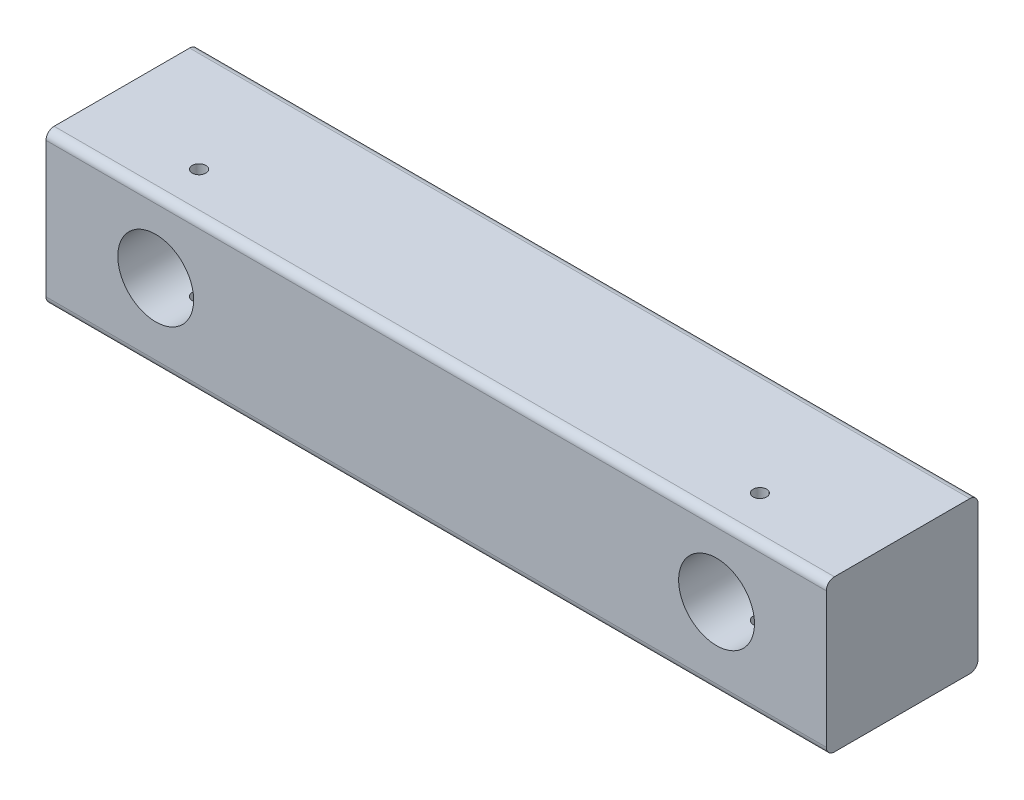
ISO-10303-21;
HEADER;
FILE_DESCRIPTION(('STEP AP214'),'2;1');
FILE_NAME('part.step','',(''),(''),'','','');
FILE_SCHEMA(('AUTOMOTIVE_DESIGN { 1 0 10303 214 1 1 1 1 }'));
ENDSEC;
DATA;
#1=APPLICATION_CONTEXT('core data for automotive mechanical design processes');
#2=APPLICATION_PROTOCOL_DEFINITION('international standard','automotive_design',2000,#1);
#3=PRODUCT_CONTEXT('',#1,'mechanical');
#4=PRODUCT('Part','Part','',(#3));
#5=PRODUCT_RELATED_PRODUCT_CATEGORY('part','',(#4));
#6=PRODUCT_DEFINITION_FORMATION('','',#4);
#7=PRODUCT_DEFINITION_CONTEXT('part definition',#1,'design');
#8=PRODUCT_DEFINITION('design','',#6,#7);
#9=PRODUCT_DEFINITION_SHAPE('','',#8);
#10=(LENGTH_UNIT() NAMED_UNIT(*) SI_UNIT(.MILLI.,.METRE.));
#11=(NAMED_UNIT(*) PLANE_ANGLE_UNIT() SI_UNIT($,.RADIAN.));
#12=(NAMED_UNIT(*) SI_UNIT($,.STERADIAN.) SOLID_ANGLE_UNIT());
#13=UNCERTAINTY_MEASURE_WITH_UNIT(LENGTH_MEASURE(1.E-05),#10,'distance_accuracy_value','');
#14=(GEOMETRIC_REPRESENTATION_CONTEXT(3) GLOBAL_UNCERTAINTY_ASSIGNED_CONTEXT((#13)) GLOBAL_UNIT_ASSIGNED_CONTEXT((#10,
#11,#12)) REPRESENTATION_CONTEXT('',''));
#15=CARTESIAN_POINT('',(0.,0.,0.));
#16=DIRECTION('',(0.,0.,1.));
#17=DIRECTION('',(1.,0.,0.));
#18=AXIS2_PLACEMENT_3D('',#15,#16,#17);
#19=CARTESIAN_POINT('',(0.,0.,-88.9));
#20=DIRECTION('',(0.,0.,-1.));
#21=DIRECTION('',(0.,1.,0.));
#22=AXIS2_PLACEMENT_3D('',#19,#20,#21);
#23=PLANE('',#22);
#24=CARTESIAN_POINT('',(164.309496882,-525.607187924995,-88.9));
#25=DIRECTION('',(0.,0.,1.));
#26=DIRECTION('',(1.,0.,0.));
#27=AXIS2_PLACEMENT_3D('',#24,#25,#26);
#28=CIRCLE('',#27,22.225);
#29=CARTESIAN_POINT('',(186.534496882,-525.607187924995,-88.9));
#30=VERTEX_POINT('',#29);
#31=EDGE_CURVE('E137',#30,#30,#28,.T.);
#32=ORIENTED_EDGE('',*,*,#31,.T.);
#33=EDGE_LOOP('',(#32));
#34=FACE_BOUND('',#33,.T.);
#35=CARTESIAN_POINT('',(-164.309496882,-525.607187924995,-88.9));
#36=DIRECTION('',(0.,0.,1.));
#37=DIRECTION('',(1.,0.,0.));
#38=AXIS2_PLACEMENT_3D('',#35,#36,#37);
#39=CIRCLE('',#38,22.225);
#40=CARTESIAN_POINT('',(-142.084496882,-525.607187924995,-88.9));
#41=VERTEX_POINT('',#40);
#42=EDGE_CURVE('E427',#41,#41,#39,.T.);
#43=ORIENTED_EDGE('',*,*,#42,.T.);
#44=EDGE_LOOP('',(#43));
#45=FACE_BOUND('',#44,.T.);
#46=DIRECTION('',(0.,-1.,0.));
#47=VECTOR('',#46,1.);
#48=CARTESIAN_POINT('',(-228.6,-571.993937924995,-88.9));
#49=LINE('',#48,#47);
#50=CARTESIAN_POINT('',(-228.6,-487.856437924995,-88.9));
#51=VERTEX_POINT('',#50);
#52=CARTESIAN_POINT('',(-228.6,-567.231437924995,-88.9));
#53=VERTEX_POINT('',#52);
#54=EDGE_CURVE('E149',#51,#53,#49,.T.);
#55=ORIENTED_EDGE('',*,*,#54,.F.);
#56=DIRECTION('',(-1.,0.,0.));
#57=VECTOR('',#56,1.);
#58=CARTESIAN_POINT('',(0.,-487.856437924995,-88.9));
#59=LINE('',#58,#57);
#60=CARTESIAN_POINT('',(228.6,-487.856437924995,-88.9));
#61=VERTEX_POINT('',#60);
#62=EDGE_CURVE('E11',#51,#61,#59,.F.);
#63=ORIENTED_EDGE('',*,*,#62,.T.);
#64=DIRECTION('',(0.,1.,0.));
#65=VECTOR('',#64,1.);
#66=CARTESIAN_POINT('',(228.6,-571.993937924995,-88.9));
#67=LINE('',#66,#65);
#68=CARTESIAN_POINT('',(228.6,-567.231437924995,-88.9));
#69=VERTEX_POINT('',#68);
#70=EDGE_CURVE('E153',#69,#61,#67,.T.);
#71=ORIENTED_EDGE('',*,*,#70,.F.);
#72=DIRECTION('',(1.,0.,0.));
#73=VECTOR('',#72,1.);
#74=CARTESIAN_POINT('',(0.,-567.231437924995,-88.9));
#75=LINE('',#74,#73);
#76=EDGE_CURVE('E52',#69,#53,#75,.F.);
#77=ORIENTED_EDGE('',*,*,#76,.T.);
#78=EDGE_LOOP('',(#55,#63,#71,#77));
#79=FACE_BOUND('',#78,.T.);
#80=ADVANCED_FACE('F43',(#34,#45,#79),#23,.T.);
#81=CARTESIAN_POINT('',(0.,0.,0.));
#82=DIRECTION('',(0.,0.,-1.));
#83=DIRECTION('',(-1.,0.,0.));
#84=AXIS2_PLACEMENT_3D('',#81,#82,#83);
#85=PLANE('',#84);
#86=CARTESIAN_POINT('',(164.309496882,-525.607187924995,0.));
#87=DIRECTION('',(0.,0.,1.));
#88=DIRECTION('',(1.,0.,0.));
#89=AXIS2_PLACEMENT_3D('',#86,#87,#88);
#90=CIRCLE('',#89,22.225);
#91=CARTESIAN_POINT('',(186.534496882,-525.607187924995,0.));
#92=VERTEX_POINT('',#91);
#93=EDGE_CURVE('E145',#92,#92,#90,.T.);
#94=ORIENTED_EDGE('',*,*,#93,.F.);
#95=EDGE_LOOP('',(#94));
#96=FACE_BOUND('',#95,.T.);
#97=CARTESIAN_POINT('',(-164.309496882,-525.607187924995,0.));
#98=DIRECTION('',(0.,0.,1.));
#99=DIRECTION('',(1.,0.,0.));
#100=AXIS2_PLACEMENT_3D('',#97,#98,#99);
#101=CIRCLE('',#100,22.225);
#102=CARTESIAN_POINT('',(-142.084496882,-525.607187924995,0.));
#103=VERTEX_POINT('',#102);
#104=EDGE_CURVE('E432',#103,#103,#101,.T.);
#105=ORIENTED_EDGE('',*,*,#104,.F.);
#106=EDGE_LOOP('',(#105));
#107=FACE_BOUND('',#106,.T.);
#108=DIRECTION('',(0.,-1.,0.));
#109=VECTOR('',#108,1.);
#110=CARTESIAN_POINT('',(-228.6,-571.993937924995,0.));
#111=LINE('',#110,#109);
#112=CARTESIAN_POINT('',(-228.6,-487.856437924995,0.));
#113=VERTEX_POINT('',#112);
#114=CARTESIAN_POINT('',(-228.6,-567.231437924995,0.));
#115=VERTEX_POINT('',#114);
#116=EDGE_CURVE('E124',#113,#115,#111,.T.);
#117=ORIENTED_EDGE('',*,*,#116,.T.);
#118=DIRECTION('',(1.,0.,0.));
#119=VECTOR('',#118,1.);
#120=CARTESIAN_POINT('',(228.6,-567.231437924995,0.));
#121=LINE('',#120,#119);
#122=CARTESIAN_POINT('',(228.6,-567.231437924995,0.));
#123=VERTEX_POINT('',#122);
#124=EDGE_CURVE('E129',#115,#123,#121,.T.);
#125=ORIENTED_EDGE('',*,*,#124,.T.);
#126=DIRECTION('',(0.,1.,0.));
#127=VECTOR('',#126,1.);
#128=CARTESIAN_POINT('',(228.6,-571.993937924995,0.));
#129=LINE('',#128,#127);
#130=CARTESIAN_POINT('',(228.6,-487.856437924995,0.));
#131=VERTEX_POINT('',#130);
#132=EDGE_CURVE('E127',#123,#131,#129,.T.);
#133=ORIENTED_EDGE('',*,*,#132,.T.);
#134=DIRECTION('',(-1.,0.,0.));
#135=VECTOR('',#134,1.);
#136=CARTESIAN_POINT('',(-228.6,-487.856437924995,0.));
#137=LINE('',#136,#135);
#138=EDGE_CURVE('E111',#131,#113,#137,.T.);
#139=ORIENTED_EDGE('',*,*,#138,.T.);
#140=EDGE_LOOP('',(#117,#125,#133,#139));
#141=FACE_BOUND('',#140,.T.);
#142=ADVANCED_FACE('F122',(#96,#107,#141),#85,.F.);
#143=CARTESIAN_POINT('',(-228.6,-571.993937924995,-554.662868850663));
#144=DIRECTION('',(0.,-1.,0.));
#145=DIRECTION('',(0.,0.,-1.));
#146=AXIS2_PLACEMENT_3D('',#143,#144,#145);
#147=PLANE('',#146);
#148=CARTESIAN_POINT('',(-164.309496882,-571.993937924995,-25.4));
#149=DIRECTION('',(0.,1.,0.));
#150=DIRECTION('',(0.,0.,1.));
#151=AXIS2_PLACEMENT_3D('',#148,#149,#150);
#152=CIRCLE('',#151,3.96874999999997);
#153=CARTESIAN_POINT('',(-164.309496882,-571.993937924995,-21.43125));
#154=VERTEX_POINT('',#153);
#155=EDGE_CURVE('E455',#154,#154,#152,.T.);
#156=ORIENTED_EDGE('',*,*,#155,.T.);
#157=EDGE_LOOP('',(#156));
#158=FACE_BOUND('',#157,.T.);
#159=CARTESIAN_POINT('',(164.309496882,-571.993937924995,-25.4));
#160=DIRECTION('',(0.,1.,0.));
#161=DIRECTION('',(0.,0.,1.));
#162=AXIS2_PLACEMENT_3D('',#159,#160,#161);
#163=CIRCLE('',#162,3.96874999999997);
#164=CARTESIAN_POINT('',(164.309496882,-571.993937924995,-21.43125));
#165=VERTEX_POINT('',#164);
#166=EDGE_CURVE('E178',#165,#165,#163,.T.);
#167=ORIENTED_EDGE('',*,*,#166,.T.);
#168=EDGE_LOOP('',(#167));
#169=FACE_BOUND('',#168,.T.);
#170=DIRECTION('',(0.,0.,1.));
#171=VECTOR('',#170,1.);
#172=CARTESIAN_POINT('',(228.6,-571.993937924995,-554.662868850663));
#173=LINE('',#172,#171);
#174=CARTESIAN_POINT('',(228.6,-571.993937924995,-84.1375));
#175=VERTEX_POINT('',#174);
#176=CARTESIAN_POINT('',(228.6,-571.993937924995,-4.7625));
#177=VERTEX_POINT('',#176);
#178=EDGE_CURVE('E142',#175,#177,#173,.T.);
#179=ORIENTED_EDGE('',*,*,#178,.T.);
#180=DIRECTION('',(1.,0.,0.));
#181=VECTOR('',#180,1.);
#182=CARTESIAN_POINT('',(-228.6,-571.993937924995,-4.7625));
#183=LINE('',#182,#181);
#184=CARTESIAN_POINT('',(-228.6,-571.993937924995,-4.7625));
#185=VERTEX_POINT('',#184);
#186=EDGE_CURVE('E117',#177,#185,#183,.F.);
#187=ORIENTED_EDGE('',*,*,#186,.T.);
#188=DIRECTION('',(0.,0.,1.));
#189=VECTOR('',#188,1.);
#190=CARTESIAN_POINT('',(-228.6,-571.993937924995,-554.662868850663));
#191=LINE('',#190,#189);
#192=CARTESIAN_POINT('',(-228.6,-571.993937924995,-84.1375));
#193=VERTEX_POINT('',#192);
#194=EDGE_CURVE('E130',#193,#185,#191,.T.);
#195=ORIENTED_EDGE('',*,*,#194,.F.);
#196=DIRECTION('',(1.,0.,0.));
#197=VECTOR('',#196,1.);
#198=CARTESIAN_POINT('',(-228.6,-571.993937924995,-84.1375));
#199=LINE('',#198,#197);
#200=EDGE_CURVE('E254',#193,#175,#199,.T.);
#201=ORIENTED_EDGE('',*,*,#200,.T.);
#202=EDGE_LOOP('',(#179,#187,#195,#201));
#203=FACE_BOUND('',#202,.T.);
#204=ADVANCED_FACE('F221',(#158,#169,#203),#147,.T.);
#205=CARTESIAN_POINT('',(228.6,-571.993937924995,-554.662868850663));
#206=DIRECTION('',(1.,0.,0.));
#207=DIRECTION('',(0.,0.,-1.));
#208=AXIS2_PLACEMENT_3D('',#205,#206,#207);
#209=PLANE('',#208);
#210=ORIENTED_EDGE('',*,*,#132,.F.);
#211=CARTESIAN_POINT('',(228.6,-567.231437924995,-4.7625));
#212=DIRECTION('',(1.,0.,0.));
#213=DIRECTION('',(0.,0.,-1.));
#214=AXIS2_PLACEMENT_3D('',#211,#212,#213);
#215=CIRCLE('',#214,4.7625);
#216=EDGE_CURVE('E291',#123,#177,#215,.T.);
#217=ORIENTED_EDGE('',*,*,#216,.T.);
#218=ORIENTED_EDGE('',*,*,#178,.F.);
#219=CARTESIAN_POINT('',(228.6,-567.231437924995,-84.1375));
#220=DIRECTION('',(1.,0.,0.));
#221=DIRECTION('',(0.,0.,-1.));
#222=AXIS2_PLACEMENT_3D('',#219,#220,#221);
#223=CIRCLE('',#222,4.7625);
#224=EDGE_CURVE('E284',#175,#69,#223,.T.);
#225=ORIENTED_EDGE('',*,*,#224,.T.);
#226=ORIENTED_EDGE('',*,*,#70,.T.);
#227=CARTESIAN_POINT('',(228.6,-487.856437924995,-84.1375));
#228=DIRECTION('',(1.,0.,0.));
#229=DIRECTION('',(0.,0.,-1.));
#230=AXIS2_PLACEMENT_3D('',#227,#228,#229);
#231=CIRCLE('',#230,4.7625);
#232=CARTESIAN_POINT('',(228.6,-483.093937924995,-84.1375));
#233=VERTEX_POINT('',#232);
#234=EDGE_CURVE('E282',#61,#233,#231,.T.);
#235=ORIENTED_EDGE('',*,*,#234,.T.);
#236=DIRECTION('',(0.,0.,1.));
#237=VECTOR('',#236,1.);
#238=CARTESIAN_POINT('',(228.6,-483.093937924995,-554.662868850663));
#239=LINE('',#238,#237);
#240=CARTESIAN_POINT('',(228.6,-483.093937924995,-4.7625));
#241=VERTEX_POINT('',#240);
#242=EDGE_CURVE('E157',#233,#241,#239,.T.);
#243=ORIENTED_EDGE('',*,*,#242,.T.);
#244=CARTESIAN_POINT('',(228.6,-487.856437924995,-4.7625));
#245=DIRECTION('',(1.,0.,0.));
#246=DIRECTION('',(0.,0.,-1.));
#247=AXIS2_PLACEMENT_3D('',#244,#245,#246);
#248=CIRCLE('',#247,4.7625);
#249=EDGE_CURVE('E286',#241,#131,#248,.T.);
#250=ORIENTED_EDGE('',*,*,#249,.T.);
#251=EDGE_LOOP('',(#210,#217,#218,#225,#226,#235,#243,#250));
#252=FACE_BOUND('',#251,.T.);
#253=ADVANCED_FACE('F228',(#252),#209,.T.);
#254=CARTESIAN_POINT('',(-228.6,-483.093937924995,-554.662868850663));
#255=DIRECTION('',(0.,1.,0.));
#256=DIRECTION('',(0.,0.,1.));
#257=AXIS2_PLACEMENT_3D('',#254,#255,#256);
#258=PLANE('',#257);
#259=CARTESIAN_POINT('',(-164.309496882,-483.093937924995,-25.4));
#260=DIRECTION('',(0.,1.,0.));
#261=DIRECTION('',(0.,0.,1.));
#262=AXIS2_PLACEMENT_3D('',#259,#260,#261);
#263=CIRCLE('',#262,3.96874999999999);
#264=CARTESIAN_POINT('',(-164.309496882,-483.093937924995,-21.43125));
#265=VERTEX_POINT('',#264);
#266=EDGE_CURVE('E459',#265,#265,#263,.T.);
#267=ORIENTED_EDGE('',*,*,#266,.F.);
#268=EDGE_LOOP('',(#267));
#269=FACE_BOUND('',#268,.T.);
#270=CARTESIAN_POINT('',(164.309496882,-483.093937924995,-25.4));
#271=DIRECTION('',(0.,1.,0.));
#272=DIRECTION('',(0.,0.,1.));
#273=AXIS2_PLACEMENT_3D('',#270,#271,#272);
#274=CIRCLE('',#273,3.96874999999999);
#275=CARTESIAN_POINT('',(164.309496882,-483.093937924995,-21.43125));
#276=VERTEX_POINT('',#275);
#277=EDGE_CURVE('E211',#276,#276,#274,.T.);
#278=ORIENTED_EDGE('',*,*,#277,.F.);
#279=EDGE_LOOP('',(#278));
#280=FACE_BOUND('',#279,.T.);
#281=ORIENTED_EDGE('',*,*,#242,.F.);
#282=DIRECTION('',(-1.,0.,0.));
#283=VECTOR('',#282,1.);
#284=CARTESIAN_POINT('',(-228.6,-483.093937924995,-84.1375));
#285=LINE('',#284,#283);
#286=CARTESIAN_POINT('',(-228.6,-483.093937924995,-84.1375));
#287=VERTEX_POINT('',#286);
#288=EDGE_CURVE('E267',#233,#287,#285,.T.);
#289=ORIENTED_EDGE('',*,*,#288,.T.);
#290=DIRECTION('',(0.,0.,1.));
#291=VECTOR('',#290,1.);
#292=CARTESIAN_POINT('',(-228.6,-483.093937924995,-554.662868850663));
#293=LINE('',#292,#291);
#294=CARTESIAN_POINT('',(-228.6,-483.093937924995,-4.7625));
#295=VERTEX_POINT('',#294);
#296=EDGE_CURVE('E152',#287,#295,#293,.T.);
#297=ORIENTED_EDGE('',*,*,#296,.T.);
#298=DIRECTION('',(-1.,0.,0.));
#299=VECTOR('',#298,1.);
#300=CARTESIAN_POINT('',(228.6,-483.093937924995,-4.7625));
#301=LINE('',#300,#299);
#302=EDGE_CURVE('E112',#295,#241,#301,.F.);
#303=ORIENTED_EDGE('',*,*,#302,.T.);
#304=EDGE_LOOP('',(#281,#289,#297,#303));
#305=FACE_BOUND('',#304,.T.);
#306=ADVANCED_FACE('F225',(#269,#280,#305),#258,.T.);
#307=CARTESIAN_POINT('',(-228.6,-571.993937924995,-554.662868850663));
#308=DIRECTION('',(-1.,0.,0.));
#309=DIRECTION('',(0.,0.,1.));
#310=AXIS2_PLACEMENT_3D('',#307,#308,#309);
#311=PLANE('',#310);
#312=ORIENTED_EDGE('',*,*,#194,.T.);
#313=CARTESIAN_POINT('',(-228.6,-567.231437924995,-4.7625));
#314=DIRECTION('',(-1.,0.,0.));
#315=DIRECTION('',(0.,0.,1.));
#316=AXIS2_PLACEMENT_3D('',#313,#314,#315);
#317=CIRCLE('',#316,4.7625);
#318=EDGE_CURVE('E135',#185,#115,#317,.T.);
#319=ORIENTED_EDGE('',*,*,#318,.T.);
#320=ORIENTED_EDGE('',*,*,#116,.F.);
#321=CARTESIAN_POINT('',(-228.6,-487.856437924995,-4.7625));
#322=DIRECTION('',(-1.,0.,0.));
#323=DIRECTION('',(0.,0.,1.));
#324=AXIS2_PLACEMENT_3D('',#321,#322,#323);
#325=CIRCLE('',#324,4.7625);
#326=EDGE_CURVE('E108',#113,#295,#325,.T.);
#327=ORIENTED_EDGE('',*,*,#326,.T.);
#328=ORIENTED_EDGE('',*,*,#296,.F.);
#329=CARTESIAN_POINT('',(-228.6,-487.856437924995,-84.1375));
#330=DIRECTION('',(-1.,0.,0.));
#331=DIRECTION('',(0.,0.,1.));
#332=AXIS2_PLACEMENT_3D('',#329,#330,#331);
#333=CIRCLE('',#332,4.7625);
#334=EDGE_CURVE('E65',#287,#51,#333,.T.);
#335=ORIENTED_EDGE('',*,*,#334,.T.);
#336=ORIENTED_EDGE('',*,*,#54,.T.);
#337=CARTESIAN_POINT('',(-228.6,-567.231437924995,-84.1375));
#338=DIRECTION('',(-1.,0.,0.));
#339=DIRECTION('',(0.,0.,1.));
#340=AXIS2_PLACEMENT_3D('',#337,#338,#339);
#341=CIRCLE('',#340,4.7625);
#342=EDGE_CURVE('E116',#53,#193,#341,.T.);
#343=ORIENTED_EDGE('',*,*,#342,.T.);
#344=EDGE_LOOP('',(#312,#319,#320,#327,#328,#335,#336,#343));
#345=FACE_BOUND('',#344,.T.);
#346=ADVANCED_FACE('F133',(#345),#311,.T.);
#347=CARTESIAN_POINT('',(-164.309496882,-525.607187924995,-88.9));
#348=DIRECTION('',(0.,0.,1.));
#349=DIRECTION('',(1.,0.,0.));
#350=AXIS2_PLACEMENT_3D('',#347,#348,#349);
#351=CYLINDRICAL_SURFACE('',#350,22.225);
#352=CARTESIAN_POINT('',(-164.309496882,-547.832187924995,-21.43125));
#353=CARTESIAN_POINT('',(-164.530539723004,-547.832184000619,-21.4312586401309));
#354=CARTESIAN_POINT('',(-164.751697227593,-547.828856109478,-21.4497791451399));
#355=CARTESIAN_POINT('',(-165.187793102213,-547.815901114411,-21.5233316141319));
#356=CARTESIAN_POINT('',(-165.402725842524,-547.806268483454,-21.5783956144551));
#357=CARTESIAN_POINT('',(-165.820001093655,-547.781782823664,-21.7233059202654));
#358=CARTESIAN_POINT('',(-166.022354327872,-547.766934314968,-21.8131221159348));
#359=CARTESIAN_POINT('',(-166.409097305582,-547.733643279863,-22.0249046550446));
#360=CARTESIAN_POINT('',(-166.593488764642,-547.715201097199,-22.1468679239167));
#361=CARTESIAN_POINT('',(-166.941107448157,-547.676537240423,-22.4208962506653));
#362=CARTESIAN_POINT('',(-167.104110324237,-547.656299942581,-22.5732437311701));
#363=CARTESIAN_POINT('',(-167.402385211821,-547.616444271707,-22.9031081648908));
#364=CARTESIAN_POINT('',(-167.537655341539,-547.596825940751,-23.0806268246981));
#365=CARTESIAN_POINT('',(-167.777543103891,-547.560277912596,-23.4573605609177));
#366=CARTESIAN_POINT('',(-167.8819353165,-547.543368381872,-23.6567213029918));
#367=CARTESIAN_POINT('',(-168.055661572932,-547.514371257378,-24.0705023393799));
#368=CARTESIAN_POINT('',(-168.124998347606,-547.502283288021,-24.2849214591491));
#369=CARTESIAN_POINT('',(-168.225931249032,-547.484454481447,-24.7203417539961));
#370=CARTESIAN_POINT('',(-168.257916937327,-547.478648176016,-24.9412498937873));
#371=CARTESIAN_POINT('',(-168.284448301456,-547.473842455249,-25.3853678886866));
#372=CARTESIAN_POINT('',(-168.278997019875,-547.474842486747,-25.6085775552725));
#373=CARTESIAN_POINT('',(-168.231125698518,-547.48347676658,-26.0481586246805));
#374=CARTESIAN_POINT('',(-168.189146247321,-547.491031946148,-26.2645797895286));
#375=CARTESIAN_POINT('',(-168.070103016254,-547.511801241172,-26.6872571354414));
#376=CARTESIAN_POINT('',(-167.993037871933,-547.525015576705,-26.893512920838));
#377=CARTESIAN_POINT('',(-167.805573008267,-547.555698139892,-27.2913069852049));
#378=CARTESIAN_POINT('',(-167.694993157032,-547.573189253298,-27.4827585370541));
#379=CARTESIAN_POINT('',(-167.443765445275,-547.6104391088,-27.844555534767));
#380=CARTESIAN_POINT('',(-167.30311480859,-547.630198060188,-28.0148990296199));
#381=CARTESIAN_POINT('',(-166.993351510892,-547.670103079664,-28.3321922207374));
#382=CARTESIAN_POINT('',(-166.823861474033,-547.690250649319,-28.4787735572925));
#383=CARTESIAN_POINT('',(-166.462499309227,-547.728403105903,-28.7414749859914));
#384=CARTESIAN_POINT('',(-166.270626994675,-547.746407974965,-28.8575948241448));
#385=CARTESIAN_POINT('',(-165.869579368589,-547.778277756257,-29.0561220751178));
#386=CARTESIAN_POINT('',(-165.660385986624,-547.792138273542,-29.1384937331479));
#387=CARTESIAN_POINT('',(-165.230830131145,-547.814123159198,-29.2668275504797));
#388=CARTESIAN_POINT('',(-165.010468734379,-547.822248079436,-29.3127932127407));
#389=CARTESIAN_POINT('',(-164.568003771293,-547.83177121633,-29.3665034430965));
#390=CARTESIAN_POINT('',(-164.345963371579,-547.833258327389,-29.37475314482));
#391=CARTESIAN_POINT('',(-163.903674791911,-547.829582922889,-29.3541485881257));
#392=CARTESIAN_POINT('',(-163.683426532834,-547.824420702519,-29.3252959768182));
#393=CARTESIAN_POINT('',(-163.252557940065,-547.808081869981,-29.2317258923966));
#394=CARTESIAN_POINT('',(-163.041880878068,-547.79694772783,-29.1672615802417));
#395=CARTESIAN_POINT('',(-162.634324548622,-547.769908287485,-29.0045701495806));
#396=CARTESIAN_POINT('',(-162.437446149337,-547.754002689418,-28.9063409089945));
#397=CARTESIAN_POINT('',(-162.060902986521,-547.718963200154,-28.6777728086266));
#398=CARTESIAN_POINT('',(-161.881430350458,-547.699798574866,-28.5471222434305));
#399=CARTESIAN_POINT('',(-161.546775982049,-547.660451667494,-28.2578450414398));
#400=CARTESIAN_POINT('',(-161.391596295425,-547.640269299893,-28.0992160509579));
#401=CARTESIAN_POINT('',(-161.10803406254,-547.60086995237,-27.7562072363195));
#402=CARTESIAN_POINT('',(-160.979994760194,-547.581667431653,-27.5715417248734));
#403=CARTESIAN_POINT('',(-160.756754002146,-547.546683457973,-27.183026518));
#404=CARTESIAN_POINT('',(-160.661551400245,-547.530901885604,-26.9791774925105));
#405=CARTESIAN_POINT('',(-160.507185046116,-547.504657947021,-26.5589921974404));
#406=CARTESIAN_POINT('',(-160.447858000571,-547.494171515688,-26.3427174903262));
#407=CARTESIAN_POINT('',(-160.366418409723,-547.479647739819,-25.9030671689553));
#408=CARTESIAN_POINT('',(-160.344302097364,-547.475609742475,-25.679692275824));
#409=CARTESIAN_POINT('',(-160.338028609234,-547.474470968887,-25.2356156308689));
#410=CARTESIAN_POINT('',(-160.353330549439,-547.477271342598,-25.0149215900373));
#411=CARTESIAN_POINT('',(-160.420281485391,-547.489275717869,-24.5793040638963));
#412=CARTESIAN_POINT('',(-160.471930310238,-547.498479689321,-24.3643805514594));
#413=CARTESIAN_POINT('',(-160.609889824388,-547.522214355847,-23.946659821797));
#414=CARTESIAN_POINT('',(-160.696147229829,-547.536736859449,-23.7438445115396));
#415=CARTESIAN_POINT('',(-160.900817928849,-547.569478941969,-23.3554771023942));
#416=CARTESIAN_POINT('',(-161.019233198785,-547.587698748099,-23.1699260654743));
#417=CARTESIAN_POINT('',(-161.286760874068,-547.626092289508,-22.8186344372683));
#418=CARTESIAN_POINT('',(-161.436268866156,-547.646289228702,-22.6531975946076));
#419=CARTESIAN_POINT('',(-161.760908511349,-547.686182761602,-22.3495777830286));
#420=CARTESIAN_POINT('',(-161.936046050363,-547.705879239152,-22.2114010916548));
#421=CARTESIAN_POINT('',(-162.308658321768,-547.742737805255,-21.9651932936352));
#422=CARTESIAN_POINT('',(-162.506301609698,-547.759878202375,-21.8574139632159));
#423=CARTESIAN_POINT('',(-162.917124698198,-547.789482129106,-21.6767581397728));
#424=CARTESIAN_POINT('',(-163.130289283669,-547.80195016711,-21.6038479823726));
#425=CARTESIAN_POINT('',(-163.505060220157,-547.818182958045,-21.5102589012337));
#426=CARTESIAN_POINT('',(-163.664440279571,-547.823405870528,-21.480679770113));
#427=CARTESIAN_POINT('',(-163.985692043138,-547.830409754377,-21.4411723664841));
#428=CARTESIAN_POINT('',(-164.147563693501,-547.832190799943,-21.4312436703494));
#429=CARTESIAN_POINT('',(-164.309496882,-547.832187924995,-21.43125));
#430=B_SPLINE_CURVE_WITH_KNOTS('',3,(#352,#353,#354,#355,#356,#357,#358,#359,#360,#361,#362,
#363,#364,#365,#366,#367,#368,#369,#370,#371,#372,#373,#374,#375,#376,#377,#378,#379,#380,#381,
#382,#383,#384,#385,#386,#387,#388,#389,#390,#391,#392,#393,#394,#395,#396,#397,#398,#399,#400,
#401,#402,#403,#404,#405,#406,#407,#408,#409,#410,#411,#412,#413,#414,#415,#416,#417,#418,#419,
#420,#421,#422,#423,#424,#425,#426,#427,#428,#429),.UNSPECIFIED.,.T.,.F.,(4,2,2,2,2,2,2,2,2,2,2,
2,2,2,2,2,2,2,2,2,2,2,2,2,2,2,2,2,2,2,2,2,2,2,2,2,2,2,4),(0.,0.662536452327345,1.32565449463126,
1.98819928351543,2.65068072913821,3.3196338990258,3.98863244525344,4.66240076645074,
5.33611659235369,6.00274114979633,6.66931152984555,7.32795172752227,7.98661754131183,
8.64888823614722,9.31122009886095,9.98299974902709,10.6547850003654,11.3272801510865,
11.9997105869367,12.663108192618,13.3264763486183,13.9851882498057,14.6439415577134,
15.309291842749,15.974698127151,16.6480747298488,17.3214278252207,17.9916925136016,
18.6618893431769,19.3224558361061,19.9830192231395,20.6425694762409,21.3021602731231,
21.9707216917796,22.6394368893943,23.3135383445744,23.986987669377,24.4723639552993,
24.9577297773034),.UNSPECIFIED.);
#431=CARTESIAN_POINT('',(-164.309496882,-547.832187924995,-21.43125));
#432=VERTEX_POINT('',#431);
#433=EDGE_CURVE('E205',#432,#432,#430,.T.);
#434=ORIENTED_EDGE('',*,*,#433,.T.);
#435=EDGE_LOOP('',(#434));
#436=FACE_BOUND('',#435,.T.);
#437=CARTESIAN_POINT('',(-164.309496882,-503.382187924995,-21.43125));
#438=CARTESIAN_POINT('',(-164.088454040996,-503.382191849371,-21.4312586401309));
#439=CARTESIAN_POINT('',(-163.867296536407,-503.385519740512,-21.4497791451399));
#440=CARTESIAN_POINT('',(-163.431200661787,-503.398474735579,-21.5233316141319));
#441=CARTESIAN_POINT('',(-163.216267921476,-503.408107366536,-21.5783956144551));
#442=CARTESIAN_POINT('',(-162.798992670345,-503.432593026326,-21.7233059202654));
#443=CARTESIAN_POINT('',(-162.596639436128,-503.447441535022,-21.8131221159349));
#444=CARTESIAN_POINT('',(-162.209896458418,-503.480732570127,-22.0249046550446));
#445=CARTESIAN_POINT('',(-162.025504999358,-503.499174752791,-22.1468679239167));
#446=CARTESIAN_POINT('',(-161.677886315843,-503.537838609566,-22.4208962506653));
#447=CARTESIAN_POINT('',(-161.514883439763,-503.558075907409,-22.5732437311701));
#448=CARTESIAN_POINT('',(-161.216608552179,-503.597931578283,-22.9031081648908));
#449=CARTESIAN_POINT('',(-161.081338422461,-503.617549909239,-23.0806268246981));
#450=CARTESIAN_POINT('',(-160.841450660109,-503.654097937394,-23.4573605609177));
#451=CARTESIAN_POINT('',(-160.737058447499,-503.671007468118,-23.6567213029918));
#452=CARTESIAN_POINT('',(-160.563332191068,-503.700004592612,-24.0705023393799));
#453=CARTESIAN_POINT('',(-160.493995416394,-503.712092561969,-24.2849214591491));
#454=CARTESIAN_POINT('',(-160.393062514967,-503.729921368542,-24.7203417539961));
#455=CARTESIAN_POINT('',(-160.361076826673,-503.735727673974,-24.9412498937873));
#456=CARTESIAN_POINT('',(-160.334545462544,-503.740533394741,-25.3853678886866));
#457=CARTESIAN_POINT('',(-160.339996744125,-503.739533363243,-25.6085775552725));
#458=CARTESIAN_POINT('',(-160.387868065482,-503.73089908341,-26.0481586246805));
#459=CARTESIAN_POINT('',(-160.429847516679,-503.723343903842,-26.2645797895286));
#460=CARTESIAN_POINT('',(-160.548890747746,-503.702574608818,-26.6872571354414));
#461=CARTESIAN_POINT('',(-160.625955892067,-503.689360273285,-26.893512920838));
#462=CARTESIAN_POINT('',(-160.813420755732,-503.658677710098,-27.2913069852049));
#463=CARTESIAN_POINT('',(-160.924000606968,-503.641186596692,-27.4827585370541));
#464=CARTESIAN_POINT('',(-161.175228318725,-503.60393674119,-27.844555534767));
#465=CARTESIAN_POINT('',(-161.31587895541,-503.584177789802,-28.0148990296199));
#466=CARTESIAN_POINT('',(-161.625642253108,-503.544272770326,-28.3321922207374));
#467=CARTESIAN_POINT('',(-161.795132289967,-503.524125200671,-28.4787735572925));
#468=CARTESIAN_POINT('',(-162.156494454773,-503.485972744087,-28.7414749859914));
#469=CARTESIAN_POINT('',(-162.348366769325,-503.467967875025,-28.8575948241448));
#470=CARTESIAN_POINT('',(-162.749414395411,-503.436098093733,-29.0561220751178));
#471=CARTESIAN_POINT('',(-162.958607777376,-503.422237576448,-29.1384937331479));
#472=CARTESIAN_POINT('',(-163.388163632855,-503.400252690792,-29.2668275504797));
#473=CARTESIAN_POINT('',(-163.608525029621,-503.392127770554,-29.3127932127407));
#474=CARTESIAN_POINT('',(-164.050989992706,-503.38260463366,-29.3665034430965));
#475=CARTESIAN_POINT('',(-164.273030392421,-503.381117522601,-29.37475314482));
#476=CARTESIAN_POINT('',(-164.715318972089,-503.3847929271,-29.3541485881257));
#477=CARTESIAN_POINT('',(-164.935567231166,-503.389955147471,-29.3252959768182));
#478=CARTESIAN_POINT('',(-165.366435823935,-503.406293980008,-29.2317258923966));
#479=CARTESIAN_POINT('',(-165.577112885932,-503.417428122159,-29.1672615802417));
#480=CARTESIAN_POINT('',(-165.984669215378,-503.444467562505,-29.0045701495806));
#481=CARTESIAN_POINT('',(-166.181547614663,-503.460373160572,-28.9063409089945));
#482=CARTESIAN_POINT('',(-166.558090777479,-503.495412649836,-28.6777728086266));
#483=CARTESIAN_POINT('',(-166.737563413542,-503.514577275124,-28.5471222434305));
#484=CARTESIAN_POINT('',(-167.072217781951,-503.553924182496,-28.2578450414398));
#485=CARTESIAN_POINT('',(-167.227397468575,-503.574106550097,-28.0992160509579));
#486=CARTESIAN_POINT('',(-167.51095970146,-503.61350589762,-27.7562072363195));
#487=CARTESIAN_POINT('',(-167.638999003806,-503.632708418337,-27.5715417248734));
#488=CARTESIAN_POINT('',(-167.862239761854,-503.667692392017,-27.183026518));
#489=CARTESIAN_POINT('',(-167.957442363755,-503.683473964386,-26.9791774925105));
#490=CARTESIAN_POINT('',(-168.111808717884,-503.709717902969,-26.5589921974404));
#491=CARTESIAN_POINT('',(-168.171135763429,-503.720204334302,-26.3427174903262));
#492=CARTESIAN_POINT('',(-168.252575354277,-503.734728110171,-25.9030671689553));
#493=CARTESIAN_POINT('',(-168.274691666636,-503.738766107515,-25.679692275824));
#494=CARTESIAN_POINT('',(-168.280965154766,-503.739904881103,-25.2356156308689));
#495=CARTESIAN_POINT('',(-168.265663214561,-503.737104507392,-25.0149215900373));
#496=CARTESIAN_POINT('',(-168.198712278609,-503.72510013212,-24.5793040638963));
#497=CARTESIAN_POINT('',(-168.147063453762,-503.715896160669,-24.3643805514594));
#498=CARTESIAN_POINT('',(-168.009103939612,-503.692161494143,-23.946659821797));
#499=CARTESIAN_POINT('',(-167.922846534171,-503.677638990541,-23.7438445115396));
#500=CARTESIAN_POINT('',(-167.718175835151,-503.644896908021,-23.3554771023942));
#501=CARTESIAN_POINT('',(-167.599760565215,-503.626677101891,-23.1699260654743));
#502=CARTESIAN_POINT('',(-167.332232889932,-503.588283560482,-22.8186344372683));
#503=CARTESIAN_POINT('',(-167.182724897844,-503.568086621288,-22.6531975946076));
#504=CARTESIAN_POINT('',(-166.858085252651,-503.528193088388,-22.3495777830286));
#505=CARTESIAN_POINT('',(-166.682947713637,-503.508496610838,-22.2114010916548));
#506=CARTESIAN_POINT('',(-166.310335442232,-503.471638044735,-21.9651932936352));
#507=CARTESIAN_POINT('',(-166.112692154302,-503.454497647615,-21.8574139632159));
#508=CARTESIAN_POINT('',(-165.701869065802,-503.424893720884,-21.6767581397728));
#509=CARTESIAN_POINT('',(-165.488704480331,-503.41242568288,-21.6038479823726));
#510=CARTESIAN_POINT('',(-165.113933543843,-503.396192891945,-21.5102589012337));
#511=CARTESIAN_POINT('',(-164.954553484429,-503.390969979462,-21.480679770113));
#512=CARTESIAN_POINT('',(-164.633301720862,-503.383966095613,-21.4411723664841));
#513=CARTESIAN_POINT('',(-164.471430070499,-503.382185050047,-21.4312436703494));
#514=CARTESIAN_POINT('',(-164.309496882,-503.382187924995,-21.43125));
#515=B_SPLINE_CURVE_WITH_KNOTS('',3,(#437,#438,#439,#440,#441,#442,#443,#444,#445,#446,#447,
#448,#449,#450,#451,#452,#453,#454,#455,#456,#457,#458,#459,#460,#461,#462,#463,#464,#465,#466,
#467,#468,#469,#470,#471,#472,#473,#474,#475,#476,#477,#478,#479,#480,#481,#482,#483,#484,#485,
#486,#487,#488,#489,#490,#491,#492,#493,#494,#495,#496,#497,#498,#499,#500,#501,#502,#503,#504,
#505,#506,#507,#508,#509,#510,#511,#512,#513,#514),.UNSPECIFIED.,.T.,.F.,(4,2,2,2,2,2,2,2,2,2,2,
2,2,2,2,2,2,2,2,2,2,2,2,2,2,2,2,2,2,2,2,2,2,2,2,2,2,2,4),(0.,0.662536452327345,1.32565449463126,
1.98819928351543,2.6506807291382,3.31963389902577,3.98863244525344,4.66240076645074,
5.33611659235369,6.00274114979632,6.66931152984555,7.32795172752226,7.98661754131183,
8.64888823614722,9.31122009886094,9.98299974902709,10.6547850003654,11.3272801510865,
11.9997105869367,12.663108192618,13.3264763486182,13.9851882498056,14.6439415577134,
15.309291842749,15.974698127151,16.6480747298488,17.3214278252207,17.9916925136016,
18.6618893431769,19.3224558361061,19.9830192231394,20.6425694762409,21.3021602731231,
21.9707216917796,22.6394368893943,23.3135383445744,23.986987669377,24.4723639552993,
24.9577297773034),.UNSPECIFIED.);
#516=CARTESIAN_POINT('',(-164.309496882,-503.382187924995,-21.43125));
#517=VERTEX_POINT('',#516);
#518=EDGE_CURVE('E200',#517,#517,#515,.T.);
#519=ORIENTED_EDGE('',*,*,#518,.T.);
#520=EDGE_LOOP('',(#519));
#521=FACE_BOUND('',#520,.T.);
#522=ORIENTED_EDGE('',*,*,#42,.F.);
#523=EDGE_LOOP('',(#522));
#524=FACE_BOUND('',#523,.T.);
#525=ORIENTED_EDGE('',*,*,#104,.T.);
#526=EDGE_LOOP('',(#525));
#527=FACE_BOUND('',#526,.T.);
#528=ADVANCED_FACE('F213',(#436,#521,#524,#527),#351,.F.);
#529=CARTESIAN_POINT('',(164.309496882,-525.607187924995,-88.9));
#530=DIRECTION('',(0.,0.,1.));
#531=DIRECTION('',(1.,0.,0.));
#532=AXIS2_PLACEMENT_3D('',#529,#530,#531);
#533=CYLINDRICAL_SURFACE('',#532,22.225);
#534=CARTESIAN_POINT('',(164.309496882,-547.832187924995,-21.43125));
#535=CARTESIAN_POINT('',(164.088454040996,-547.832184000619,-21.4312586401309));
#536=CARTESIAN_POINT('',(163.867296536407,-547.828856109477,-21.44977914514));
#537=CARTESIAN_POINT('',(163.431200661787,-547.815901114411,-21.5233316141319));
#538=CARTESIAN_POINT('',(163.216267921476,-547.806268483454,-21.5783956144551));
#539=CARTESIAN_POINT('',(162.798992670345,-547.781782823664,-21.7233059202654));
#540=CARTESIAN_POINT('',(162.596639436128,-547.766934314968,-21.8131221159349));
#541=CARTESIAN_POINT('',(162.209896458418,-547.733643279863,-22.0249046550446));
#542=CARTESIAN_POINT('',(162.025504999358,-547.715201097199,-22.1468679239167));
#543=CARTESIAN_POINT('',(161.677886315843,-547.676537240423,-22.4208962506654));
#544=CARTESIAN_POINT('',(161.514883439763,-547.656299942581,-22.5732437311701));
#545=CARTESIAN_POINT('',(161.216608552179,-547.616444271707,-22.9031081648908));
#546=CARTESIAN_POINT('',(161.081338422461,-547.596825940751,-23.0806268246981));
#547=CARTESIAN_POINT('',(160.841450660109,-547.560277912596,-23.4573605609177));
#548=CARTESIAN_POINT('',(160.7370584475,-547.543368381872,-23.6567213029918));
#549=CARTESIAN_POINT('',(160.563332191068,-547.514371257378,-24.0705023393799));
#550=CARTESIAN_POINT('',(160.493995416394,-547.50228328802,-24.2849214591491));
#551=CARTESIAN_POINT('',(160.393062514968,-547.484454481447,-24.7203417539961));
#552=CARTESIAN_POINT('',(160.361076826673,-547.478648176016,-24.9412498937873));
#553=CARTESIAN_POINT('',(160.334545462544,-547.473842455249,-25.3853678886867));
#554=CARTESIAN_POINT('',(160.339996744125,-547.474842486747,-25.6085775552725));
#555=CARTESIAN_POINT('',(160.387868065482,-547.48347676658,-26.0481586246805));
#556=CARTESIAN_POINT('',(160.429847516679,-547.491031946148,-26.2645797895286));
#557=CARTESIAN_POINT('',(160.548890747746,-547.511801241172,-26.6872571354414));
#558=CARTESIAN_POINT('',(160.625955892067,-547.525015576705,-26.893512920838));
#559=CARTESIAN_POINT('',(160.813420755733,-547.555698139892,-27.2913069852049));
#560=CARTESIAN_POINT('',(160.924000606968,-547.573189253298,-27.4827585370541));
#561=CARTESIAN_POINT('',(161.175228318725,-547.6104391088,-27.8445555347671));
#562=CARTESIAN_POINT('',(161.31587895541,-547.630198060188,-28.01489902962));
#563=CARTESIAN_POINT('',(161.625642253108,-547.670103079664,-28.3321922207374));
#564=CARTESIAN_POINT('',(161.795132289967,-547.690250649319,-28.4787735572926));
#565=CARTESIAN_POINT('',(162.156494454773,-547.728403105903,-28.7414749859914));
#566=CARTESIAN_POINT('',(162.348366769325,-547.746407974964,-28.8575948241449));
#567=CARTESIAN_POINT('',(162.749414395411,-547.778277756257,-29.0561220751178));
#568=CARTESIAN_POINT('',(162.958607777376,-547.792138273542,-29.1384937331479));
#569=CARTESIAN_POINT('',(163.388163632855,-547.814123159198,-29.2668275504797));
#570=CARTESIAN_POINT('',(163.608525029621,-547.822248079435,-29.3127932127407));
#571=CARTESIAN_POINT('',(164.050989992707,-547.83177121633,-29.3665034430965));
#572=CARTESIAN_POINT('',(164.273030392421,-547.833258327389,-29.37475314482));
#573=CARTESIAN_POINT('',(164.715318972089,-547.829582922889,-29.3541485881257));
#574=CARTESIAN_POINT('',(164.935567231166,-547.824420702519,-29.3252959768182));
#575=CARTESIAN_POINT('',(165.366435823935,-547.808081869981,-29.2317258923966));
#576=CARTESIAN_POINT('',(165.577112885932,-547.79694772783,-29.1672615802417));
#577=CARTESIAN_POINT('',(165.984669215378,-547.769908287485,-29.0045701495806));
#578=CARTESIAN_POINT('',(166.181547614663,-547.754002689418,-28.9063409089945));
#579=CARTESIAN_POINT('',(166.558090777479,-547.718963200154,-28.6777728086266));
#580=CARTESIAN_POINT('',(166.737563413542,-547.699798574866,-28.5471222434305));
#581=CARTESIAN_POINT('',(167.072217781951,-547.660451667493,-28.2578450414398));
#582=CARTESIAN_POINT('',(167.227397468575,-547.640269299893,-28.0992160509579));
#583=CARTESIAN_POINT('',(167.51095970146,-547.60086995237,-27.7562072363195));
#584=CARTESIAN_POINT('',(167.638999003806,-547.581667431653,-27.5715417248734));
#585=CARTESIAN_POINT('',(167.862239761854,-547.546683457973,-27.183026518));
#586=CARTESIAN_POINT('',(167.957442363755,-547.530901885604,-26.9791774925105));
#587=CARTESIAN_POINT('',(168.111808717884,-547.504657947021,-26.5589921974404));
#588=CARTESIAN_POINT('',(168.171135763429,-547.494171515687,-26.3427174903263));
#589=CARTESIAN_POINT('',(168.252575354277,-547.479647739819,-25.9030671689553));
#590=CARTESIAN_POINT('',(168.274691666636,-547.475609742475,-25.679692275824));
#591=CARTESIAN_POINT('',(168.280965154766,-547.474470968887,-25.2356156308689));
#592=CARTESIAN_POINT('',(168.265663214561,-547.477271342598,-25.0149215900373));
#593=CARTESIAN_POINT('',(168.198712278609,-547.489275717869,-24.5793040638963));
#594=CARTESIAN_POINT('',(168.147063453762,-547.498479689321,-24.3643805514594));
#595=CARTESIAN_POINT('',(168.009103939612,-547.522214355846,-23.946659821797));
#596=CARTESIAN_POINT('',(167.922846534171,-547.536736859448,-23.7438445115396));
#597=CARTESIAN_POINT('',(167.718175835151,-547.569478941969,-23.3554771023942));
#598=CARTESIAN_POINT('',(167.599760565215,-547.587698748099,-23.1699260654743));
#599=CARTESIAN_POINT('',(167.332232889932,-547.626092289508,-22.8186344372683));
#600=CARTESIAN_POINT('',(167.182724897844,-547.646289228702,-22.6531975946076));
#601=CARTESIAN_POINT('',(166.858085252651,-547.686182761602,-22.3495777830286));
#602=CARTESIAN_POINT('',(166.682947713637,-547.705879239152,-22.2114010916548));
#603=CARTESIAN_POINT('',(166.310335442232,-547.742737805255,-21.9651932936353));
#604=CARTESIAN_POINT('',(166.112692154302,-547.759878202375,-21.8574139632159));
#605=CARTESIAN_POINT('',(165.701869065802,-547.789482129106,-21.6767581397728));
#606=CARTESIAN_POINT('',(165.488704480331,-547.80195016711,-21.6038479823726));
#607=CARTESIAN_POINT('',(165.113933543843,-547.818182958045,-21.5102589012337));
#608=CARTESIAN_POINT('',(164.954553484429,-547.823405870528,-21.480679770113));
#609=CARTESIAN_POINT('',(164.633301720862,-547.830409754377,-21.4411723664841));
#610=CARTESIAN_POINT('',(164.471430070499,-547.832190799943,-21.4312436703494));
#611=CARTESIAN_POINT('',(164.309496882,-547.832187924995,-21.43125));
#612=B_SPLINE_CURVE_WITH_KNOTS('',3,(#534,#535,#536,#537,#538,#539,#540,#541,#542,#543,#544,
#545,#546,#547,#548,#549,#550,#551,#552,#553,#554,#555,#556,#557,#558,#559,#560,#561,#562,#563,
#564,#565,#566,#567,#568,#569,#570,#571,#572,#573,#574,#575,#576,#577,#578,#579,#580,#581,#582,
#583,#584,#585,#586,#587,#588,#589,#590,#591,#592,#593,#594,#595,#596,#597,#598,#599,#600,#601,
#602,#603,#604,#605,#606,#607,#608,#609,#610,#611),.UNSPECIFIED.,.T.,.F.,(4,2,2,2,2,2,2,2,2,2,2,
2,2,2,2,2,2,2,2,2,2,2,2,2,2,2,2,2,2,2,2,2,2,2,2,2,2,2,4),(0.,0.662536452327345,1.32565449463126,
1.98819928351543,2.65068072913821,3.31963389902577,3.98863244525344,4.66240076645073,
5.33611659235369,6.00274114979632,6.66931152984553,7.32795172752225,7.98661754131183,
8.64888823614723,9.31122009886095,9.98299974902709,10.6547850003654,11.3272801510865,
11.9997105869367,12.663108192618,13.3264763486183,13.9851882498057,14.6439415577134,
15.309291842749,15.974698127151,16.6480747298488,17.3214278252207,17.9916925136016,
18.6618893431769,19.3224558361062,19.9830192231395,20.6425694762409,21.3021602731232,
21.9707216917796,22.6394368893943,23.3135383445744,23.986987669377,24.4723639552993,
24.9577297773034),.UNSPECIFIED.);
#613=CARTESIAN_POINT('',(164.309496882,-547.832187924995,-21.43125));
#614=VERTEX_POINT('',#613);
#615=EDGE_CURVE('E177',#614,#614,#612,.T.);
#616=ORIENTED_EDGE('',*,*,#615,.T.);
#617=EDGE_LOOP('',(#616));
#618=FACE_BOUND('',#617,.T.);
#619=CARTESIAN_POINT('',(164.309496882,-503.382187924995,-21.43125));
#620=CARTESIAN_POINT('',(164.530539723004,-503.382191849371,-21.4312586401309));
#621=CARTESIAN_POINT('',(164.751697227593,-503.385519740512,-21.44977914514));
#622=CARTESIAN_POINT('',(165.187793102213,-503.398474735579,-21.5233316141319));
#623=CARTESIAN_POINT('',(165.402725842524,-503.408107366535,-21.5783956144551));
#624=CARTESIAN_POINT('',(165.820001093655,-503.432593026325,-21.7233059202654));
#625=CARTESIAN_POINT('',(166.022354327872,-503.447441535022,-21.8131221159349));
#626=CARTESIAN_POINT('',(166.409097305582,-503.480732570127,-22.0249046550446));
#627=CARTESIAN_POINT('',(166.593488764642,-503.49917475279,-22.1468679239167));
#628=CARTESIAN_POINT('',(166.941107448157,-503.537838609566,-22.4208962506654));
#629=CARTESIAN_POINT('',(167.104110324237,-503.558075907409,-22.5732437311701));
#630=CARTESIAN_POINT('',(167.402385211821,-503.597931578283,-22.9031081648908));
#631=CARTESIAN_POINT('',(167.537655341539,-503.617549909239,-23.0806268246981));
#632=CARTESIAN_POINT('',(167.777543103891,-503.654097937393,-23.4573605609177));
#633=CARTESIAN_POINT('',(167.881935316501,-503.671007468118,-23.6567213029918));
#634=CARTESIAN_POINT('',(168.055661572932,-503.700004592612,-24.0705023393799));
#635=CARTESIAN_POINT('',(168.124998347606,-503.712092561969,-24.2849214591491));
#636=CARTESIAN_POINT('',(168.225931249033,-503.729921368542,-24.7203417539961));
#637=CARTESIAN_POINT('',(168.257916937327,-503.735727673974,-24.9412498937873));
#638=CARTESIAN_POINT('',(168.284448301456,-503.740533394741,-25.3853678886867));
#639=CARTESIAN_POINT('',(168.278997019875,-503.739533363243,-25.6085775552725));
#640=CARTESIAN_POINT('',(168.231125698518,-503.73089908341,-26.0481586246805));
#641=CARTESIAN_POINT('',(168.189146247321,-503.723343903841,-26.2645797895286));
#642=CARTESIAN_POINT('',(168.070103016255,-503.702574608818,-26.6872571354414));
#643=CARTESIAN_POINT('',(167.993037871933,-503.689360273285,-26.893512920838));
#644=CARTESIAN_POINT('',(167.805573008268,-503.658677710098,-27.2913069852049));
#645=CARTESIAN_POINT('',(167.694993157032,-503.641186596692,-27.4827585370541));
#646=CARTESIAN_POINT('',(167.443765445275,-503.60393674119,-27.8445555347671));
#647=CARTESIAN_POINT('',(167.30311480859,-503.584177789802,-28.01489902962));
#648=CARTESIAN_POINT('',(166.993351510892,-503.544272770326,-28.3321922207374));
#649=CARTESIAN_POINT('',(166.823861474033,-503.524125200671,-28.4787735572926));
#650=CARTESIAN_POINT('',(166.462499309227,-503.485972744087,-28.7414749859914));
#651=CARTESIAN_POINT('',(166.270626994675,-503.467967875025,-28.8575948241449));
#652=CARTESIAN_POINT('',(165.869579368589,-503.436098093733,-29.0561220751178));
#653=CARTESIAN_POINT('',(165.660385986624,-503.422237576448,-29.1384937331479));
#654=CARTESIAN_POINT('',(165.230830131145,-503.400252690792,-29.2668275504797));
#655=CARTESIAN_POINT('',(165.010468734379,-503.392127770554,-29.3127932127407));
#656=CARTESIAN_POINT('',(164.568003771294,-503.382604633659,-29.3665034430965));
#657=CARTESIAN_POINT('',(164.345963371579,-503.3811175226,-29.37475314482));
#658=CARTESIAN_POINT('',(163.903674791911,-503.3847929271,-29.3541485881257));
#659=CARTESIAN_POINT('',(163.683426532834,-503.389955147471,-29.3252959768182));
#660=CARTESIAN_POINT('',(163.252557940065,-503.406293980008,-29.2317258923966));
#661=CARTESIAN_POINT('',(163.041880878068,-503.417428122159,-29.1672615802417));
#662=CARTESIAN_POINT('',(162.634324548622,-503.444467562505,-29.0045701495806));
#663=CARTESIAN_POINT('',(162.437446149337,-503.460373160571,-28.9063409089945));
#664=CARTESIAN_POINT('',(162.060902986521,-503.495412649836,-28.6777728086266));
#665=CARTESIAN_POINT('',(161.881430350458,-503.514577275124,-28.5471222434305));
#666=CARTESIAN_POINT('',(161.546775982049,-503.553924182496,-28.2578450414398));
#667=CARTESIAN_POINT('',(161.391596295425,-503.574106550097,-28.0992160509579));
#668=CARTESIAN_POINT('',(161.10803406254,-503.61350589762,-27.7562072363195));
#669=CARTESIAN_POINT('',(160.979994760194,-503.632708418337,-27.5715417248734));
#670=CARTESIAN_POINT('',(160.756754002146,-503.667692392017,-27.183026518));
#671=CARTESIAN_POINT('',(160.661551400245,-503.683473964386,-26.9791774925105));
#672=CARTESIAN_POINT('',(160.507185046116,-503.709717902969,-26.5589921974404));
#673=CARTESIAN_POINT('',(160.447858000571,-503.720204334302,-26.3427174903263));
#674=CARTESIAN_POINT('',(160.366418409723,-503.73472811017,-25.9030671689553));
#675=CARTESIAN_POINT('',(160.344302097364,-503.738766107515,-25.679692275824));
#676=CARTESIAN_POINT('',(160.338028609234,-503.739904881103,-25.2356156308689));
#677=CARTESIAN_POINT('',(160.353330549439,-503.737104507392,-25.0149215900373));
#678=CARTESIAN_POINT('',(160.420281485391,-503.72510013212,-24.5793040638963));
#679=CARTESIAN_POINT('',(160.471930310238,-503.715896160669,-24.3643805514594));
#680=CARTESIAN_POINT('',(160.609889824388,-503.692161494143,-23.946659821797));
#681=CARTESIAN_POINT('',(160.696147229829,-503.677638990541,-23.7438445115396));
#682=CARTESIAN_POINT('',(160.900817928849,-503.644896908021,-23.3554771023942));
#683=CARTESIAN_POINT('',(161.019233198785,-503.626677101891,-23.1699260654743));
#684=CARTESIAN_POINT('',(161.286760874068,-503.588283560482,-22.8186344372683));
#685=CARTESIAN_POINT('',(161.436268866156,-503.568086621288,-22.6531975946076));
#686=CARTESIAN_POINT('',(161.760908511349,-503.528193088388,-22.3495777830286));
#687=CARTESIAN_POINT('',(161.936046050363,-503.508496610837,-22.2114010916548));
#688=CARTESIAN_POINT('',(162.308658321768,-503.471638044734,-21.9651932936353));
#689=CARTESIAN_POINT('',(162.506301609698,-503.454497647615,-21.8574139632159));
#690=CARTESIAN_POINT('',(162.917124698198,-503.424893720884,-21.6767581397728));
#691=CARTESIAN_POINT('',(163.130289283669,-503.41242568288,-21.6038479823726));
#692=CARTESIAN_POINT('',(163.505060220157,-503.396192891945,-21.5102589012337));
#693=CARTESIAN_POINT('',(163.664440279571,-503.390969979462,-21.480679770113));
#694=CARTESIAN_POINT('',(163.985692043138,-503.383966095613,-21.4411723664841));
#695=CARTESIAN_POINT('',(164.147563693501,-503.382185050047,-21.4312436703494));
#696=CARTESIAN_POINT('',(164.309496882,-503.382187924995,-21.43125));
#697=B_SPLINE_CURVE_WITH_KNOTS('',3,(#619,#620,#621,#622,#623,#624,#625,#626,#627,#628,#629,
#630,#631,#632,#633,#634,#635,#636,#637,#638,#639,#640,#641,#642,#643,#644,#645,#646,#647,#648,
#649,#650,#651,#652,#653,#654,#655,#656,#657,#658,#659,#660,#661,#662,#663,#664,#665,#666,#667,
#668,#669,#670,#671,#672,#673,#674,#675,#676,#677,#678,#679,#680,#681,#682,#683,#684,#685,#686,
#687,#688,#689,#690,#691,#692,#693,#694,#695,#696),.UNSPECIFIED.,.T.,.F.,(4,2,2,2,2,2,2,2,2,2,2,
2,2,2,2,2,2,2,2,2,2,2,2,2,2,2,2,2,2,2,2,2,2,2,2,2,2,2,4),(0.,0.662536452327345,1.32565449463126,
1.9881992835154,2.6506807291382,3.31963389902577,3.98863244525344,4.66240076645073,
5.33611659235369,6.00274114979632,6.66931152984553,7.32795172752224,7.98661754131183,
8.64888823614723,9.31122009886095,9.98299974902709,10.6547850003654,11.3272801510865,
11.9997105869367,12.663108192618,13.3264763486183,13.9851882498057,14.6439415577134,
15.309291842749,15.974698127151,16.6480747298488,17.3214278252207,17.9916925136016,
18.6618893431769,19.3224558361062,19.9830192231395,20.6425694762409,21.3021602731232,
21.9707216917796,22.6394368893943,23.3135383445744,23.986987669377,24.4723639552993,
24.9577297773034),.UNSPECIFIED.);
#698=CARTESIAN_POINT('',(164.309496882,-503.382187924995,-21.43125));
#699=VERTEX_POINT('',#698);
#700=EDGE_CURVE('E168',#699,#699,#697,.T.);
#701=ORIENTED_EDGE('',*,*,#700,.T.);
#702=EDGE_LOOP('',(#701));
#703=FACE_BOUND('',#702,.T.);
#704=ORIENTED_EDGE('',*,*,#31,.F.);
#705=EDGE_LOOP('',(#704));
#706=FACE_BOUND('',#705,.T.);
#707=ORIENTED_EDGE('',*,*,#93,.T.);
#708=EDGE_LOOP('',(#707));
#709=FACE_BOUND('',#708,.T.);
#710=ADVANCED_FACE('F183',(#618,#703,#706,#709),#533,.F.);
#711=CARTESIAN_POINT('',(164.309496882,-483.093937924995,-25.4));
#712=DIRECTION('',(0.,1.,0.));
#713=DIRECTION('',(0.,0.,1.));
#714=AXIS2_PLACEMENT_3D('',#711,#712,#713);
#715=CYLINDRICAL_SURFACE('',#714,3.96874999999998);
#716=ORIENTED_EDGE('',*,*,#277,.T.);
#717=EDGE_LOOP('',(#716));
#718=FACE_BOUND('',#717,.T.);
#719=ORIENTED_EDGE('',*,*,#700,.F.);
#720=EDGE_LOOP('',(#719));
#721=FACE_BOUND('',#720,.T.);
#722=ADVANCED_FACE('F191',(#718,#721),#715,.F.);
#723=ORIENTED_EDGE('',*,*,#166,.F.);
#724=EDGE_LOOP('',(#723));
#725=FACE_BOUND('',#724,.T.);
#726=ORIENTED_EDGE('',*,*,#615,.F.);
#727=EDGE_LOOP('',(#726));
#728=FACE_BOUND('',#727,.T.);
#729=ADVANCED_FACE('F186',(#725,#728),#715,.F.);
#730=CARTESIAN_POINT('',(-164.309496882,-483.093937924995,-25.4));
#731=DIRECTION('',(0.,1.,0.));
#732=DIRECTION('',(0.,0.,1.));
#733=AXIS2_PLACEMENT_3D('',#730,#731,#732);
#734=CYLINDRICAL_SURFACE('',#733,3.96874999999998);
#735=ORIENTED_EDGE('',*,*,#266,.T.);
#736=EDGE_LOOP('',(#735));
#737=FACE_BOUND('',#736,.T.);
#738=ORIENTED_EDGE('',*,*,#518,.F.);
#739=EDGE_LOOP('',(#738));
#740=FACE_BOUND('',#739,.T.);
#741=ADVANCED_FACE('F190',(#737,#740),#734,.F.);
#742=ORIENTED_EDGE('',*,*,#155,.F.);
#743=EDGE_LOOP('',(#742));
#744=FACE_BOUND('',#743,.T.);
#745=ORIENTED_EDGE('',*,*,#433,.F.);
#746=EDGE_LOOP('',(#745));
#747=FACE_BOUND('',#746,.T.);
#748=ADVANCED_FACE('F193',(#744,#747),#734,.F.);
#749=CARTESIAN_POINT('',(0.,-567.231437924995,-4.7625));
#750=DIRECTION('',(-1.,0.,0.));
#751=DIRECTION('',(0.,0.,1.));
#752=AXIS2_PLACEMENT_3D('',#749,#750,#751);
#753=CYLINDRICAL_SURFACE('',#752,4.7625);
#754=ORIENTED_EDGE('',*,*,#318,.F.);
#755=ORIENTED_EDGE('',*,*,#186,.F.);
#756=ORIENTED_EDGE('',*,*,#216,.F.);
#757=ORIENTED_EDGE('',*,*,#124,.F.);
#758=EDGE_LOOP('',(#754,#755,#756,#757));
#759=FACE_BOUND('',#758,.T.);
#760=ADVANCED_FACE('F197',(#759),#753,.T.);
#761=CARTESIAN_POINT('',(-228.6,-487.856437924995,-84.1375));
#762=DIRECTION('',(-1.,0.,0.));
#763=DIRECTION('',(0.,0.,1.));
#764=AXIS2_PLACEMENT_3D('',#761,#762,#763);
#765=CYLINDRICAL_SURFACE('',#764,4.7625);
#766=ORIENTED_EDGE('',*,*,#234,.F.);
#767=ORIENTED_EDGE('',*,*,#62,.F.);
#768=ORIENTED_EDGE('',*,*,#334,.F.);
#769=ORIENTED_EDGE('',*,*,#288,.F.);
#770=EDGE_LOOP('',(#766,#767,#768,#769));
#771=FACE_BOUND('',#770,.T.);
#772=ADVANCED_FACE('F241',(#771),#765,.T.);
#773=CARTESIAN_POINT('',(-228.6,-567.231437924995,-84.1375));
#774=DIRECTION('',(1.,0.,0.));
#775=DIRECTION('',(0.,0.,-1.));
#776=AXIS2_PLACEMENT_3D('',#773,#774,#775);
#777=CYLINDRICAL_SURFACE('',#776,4.7625);
#778=ORIENTED_EDGE('',*,*,#342,.F.);
#779=ORIENTED_EDGE('',*,*,#76,.F.);
#780=ORIENTED_EDGE('',*,*,#224,.F.);
#781=ORIENTED_EDGE('',*,*,#200,.F.);
#782=EDGE_LOOP('',(#778,#779,#780,#781));
#783=FACE_BOUND('',#782,.T.);
#784=ADVANCED_FACE('F244',(#783),#777,.T.);
#785=CARTESIAN_POINT('',(0.,-487.856437924995,-4.7625));
#786=DIRECTION('',(1.,0.,0.));
#787=DIRECTION('',(0.,0.,-1.));
#788=AXIS2_PLACEMENT_3D('',#785,#786,#787);
#789=CYLINDRICAL_SURFACE('',#788,4.7625);
#790=ORIENTED_EDGE('',*,*,#249,.F.);
#791=ORIENTED_EDGE('',*,*,#302,.F.);
#792=ORIENTED_EDGE('',*,*,#326,.F.);
#793=ORIENTED_EDGE('',*,*,#138,.F.);
#794=EDGE_LOOP('',(#790,#791,#792,#793));
#795=FACE_BOUND('',#794,.T.);
#796=ADVANCED_FACE('F45',(#795),#789,.T.);
#797=CLOSED_SHELL('',(#80,#142,#204,#253,#306,#346,#528,#710,#722,#729,#741,#748,#760,#772,#784,#796));
#798=MANIFOLD_SOLID_BREP('B2',#797);
#799=ADVANCED_BREP_SHAPE_REPRESENTATION('',(#18,#798),#14);
#800=SHAPE_DEFINITION_REPRESENTATION(#9,#799);
ENDSEC;
END-ISO-10303-21;
